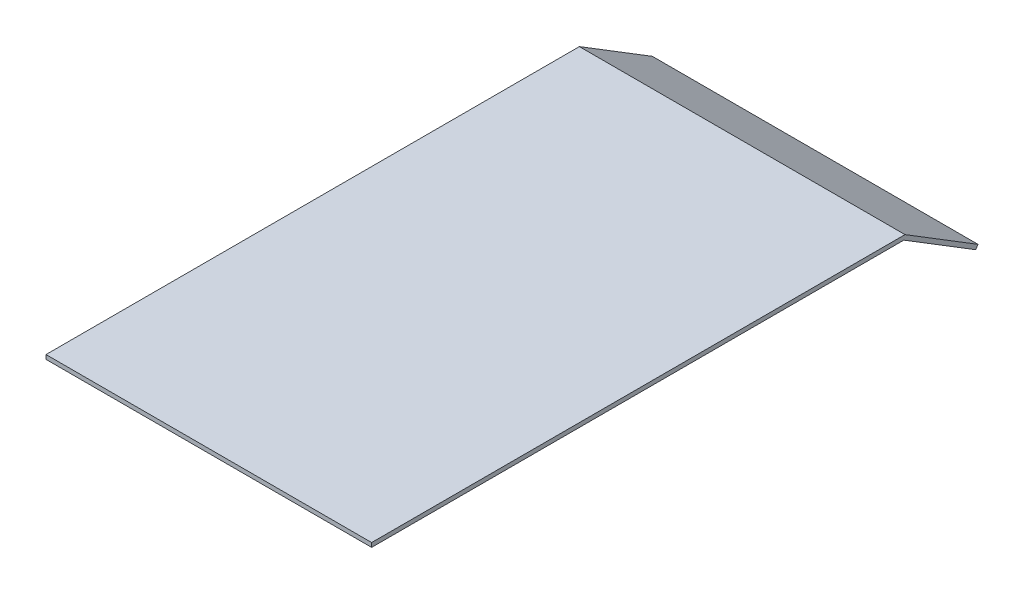
ISO-10303-21;
HEADER;
FILE_DESCRIPTION(('STEP AP214'),'2;1');
FILE_NAME('part.step','',(''),(''),'','','');
FILE_SCHEMA(('AUTOMOTIVE_DESIGN { 1 0 10303 214 1 1 1 1 }'));
ENDSEC;
DATA;
#1=APPLICATION_CONTEXT('core data for automotive mechanical design processes');
#2=APPLICATION_PROTOCOL_DEFINITION('international standard','automotive_design',2000,#1);
#3=PRODUCT_CONTEXT('',#1,'mechanical');
#4=PRODUCT('Part','Part','',(#3));
#5=PRODUCT_RELATED_PRODUCT_CATEGORY('part','',(#4));
#6=PRODUCT_DEFINITION_FORMATION('','',#4);
#7=PRODUCT_DEFINITION_CONTEXT('part definition',#1,'design');
#8=PRODUCT_DEFINITION('design','',#6,#7);
#9=PRODUCT_DEFINITION_SHAPE('','',#8);
#10=(LENGTH_UNIT() NAMED_UNIT(*) SI_UNIT(.MILLI.,.METRE.));
#11=(NAMED_UNIT(*) PLANE_ANGLE_UNIT() SI_UNIT($,.RADIAN.));
#12=(NAMED_UNIT(*) SI_UNIT($,.STERADIAN.) SOLID_ANGLE_UNIT());
#13=UNCERTAINTY_MEASURE_WITH_UNIT(LENGTH_MEASURE(1.E-05),#10,'distance_accuracy_value','');
#14=(GEOMETRIC_REPRESENTATION_CONTEXT(3) GLOBAL_UNCERTAINTY_ASSIGNED_CONTEXT((#13)) GLOBAL_UNIT_ASSIGNED_CONTEXT((#10,
#11,#12)) REPRESENTATION_CONTEXT('',''));
#15=CARTESIAN_POINT('',(0.,0.,0.));
#16=DIRECTION('',(0.,0.,1.));
#17=DIRECTION('',(1.,0.,0.));
#18=AXIS2_PLACEMENT_3D('',#15,#16,#17);
#19=CARTESIAN_POINT('',(116.,3.,-190.));
#20=DIRECTION('',(-1.,0.,0.));
#21=DIRECTION('',(0.,0.,1.));
#22=AXIS2_PLACEMENT_3D('',#19,#20,#21);
#23=PLANE('',#22);
#24=DIRECTION('',(0.,0.,-1.));
#25=VECTOR('',#24,1.);
#26=CARTESIAN_POINT('',(116.,0.,-190.));
#27=LINE('',#26,#25);
#28=CARTESIAN_POINT('',(116.,0.,190.));
#29=VERTEX_POINT('',#28);
#30=CARTESIAN_POINT('',(116.,0.,-189.150873429072));
#31=VERTEX_POINT('',#30);
#32=EDGE_CURVE('E121',#29,#31,#27,.T.);
#33=ORIENTED_EDGE('',*,*,#32,.T.);
#34=DIRECTION('',(0.,-0.524097425664335,-0.851658316704544));
#35=VECTOR('',#34,1.);
#36=CARTESIAN_POINT('',(116.,0.445025049886368,-188.427707723007));
#37=LINE('',#36,#35);
#38=CARTESIAN_POINT('',(116.,-31.5549749501136,-240.427707723007));
#39=VERTEX_POINT('',#38);
#40=EDGE_CURVE('E157',#31,#39,#37,.T.);
#41=ORIENTED_EDGE('',*,*,#40,.T.);
#42=DIRECTION('',(0.,-0.851658316704548,0.524097425664328));
#43=VECTOR('',#42,1.);
#44=CARTESIAN_POINT('',(116.,-29.,-242.));
#45=LINE('',#44,#43);
#46=CARTESIAN_POINT('',(116.,-29.,-242.));
#47=VERTEX_POINT('',#46);
#48=EDGE_CURVE('E115',#47,#39,#45,.T.);
#49=ORIENTED_EDGE('',*,*,#48,.F.);
#50=DIRECTION('',(0.,-0.524097425664335,-0.851658316704544));
#51=VECTOR('',#50,1.);
#52=CARTESIAN_POINT('',(116.,3.,-190.));
#53=LINE('',#52,#51);
#54=CARTESIAN_POINT('',(116.,3.,-190.));
#55=VERTEX_POINT('',#54);
#56=EDGE_CURVE('E102',#55,#47,#53,.T.);
#57=ORIENTED_EDGE('',*,*,#56,.F.);
#58=DIRECTION('',(0.,0.,-1.));
#59=VECTOR('',#58,1.);
#60=CARTESIAN_POINT('',(116.,3.,-190.));
#61=LINE('',#60,#59);
#62=CARTESIAN_POINT('',(116.,3.,190.));
#63=VERTEX_POINT('',#62);
#64=EDGE_CURVE('E126',#63,#55,#61,.T.);
#65=ORIENTED_EDGE('',*,*,#64,.F.);
#66=DIRECTION('',(0.,-1.,0.));
#67=VECTOR('',#66,1.);
#68=CARTESIAN_POINT('',(116.,3.,190.));
#69=LINE('',#68,#67);
#70=EDGE_CURVE('E139',#63,#29,#69,.T.);
#71=ORIENTED_EDGE('',*,*,#70,.T.);
#72=EDGE_LOOP('',(#33,#41,#49,#57,#65,#71));
#73=FACE_BOUND('',#72,.T.);
#74=ADVANCED_FACE('F39',(#73),#23,.F.);
#75=CARTESIAN_POINT('',(-116.,3.,-190.));
#76=DIRECTION('',(1.,0.,0.));
#77=DIRECTION('',(0.,0.,-1.));
#78=AXIS2_PLACEMENT_3D('',#75,#76,#77);
#79=PLANE('',#78);
#80=DIRECTION('',(0.,-0.524097425664335,-0.851658316704544));
#81=VECTOR('',#80,1.);
#82=CARTESIAN_POINT('',(-116.,0.445025049886368,-188.427707723007));
#83=LINE('',#82,#81);
#84=CARTESIAN_POINT('',(-116.,0.,-189.150873429072));
#85=VERTEX_POINT('',#84);
#86=CARTESIAN_POINT('',(-116.,-31.5549749501136,-240.427707723007));
#87=VERTEX_POINT('',#86);
#88=EDGE_CURVE('E94',#85,#87,#83,.T.);
#89=ORIENTED_EDGE('',*,*,#88,.F.);
#90=DIRECTION('',(0.,0.,1.));
#91=VECTOR('',#90,1.);
#92=CARTESIAN_POINT('',(-116.,0.,-190.));
#93=LINE('',#92,#91);
#94=CARTESIAN_POINT('',(-116.,0.,190.));
#95=VERTEX_POINT('',#94);
#96=EDGE_CURVE('E67',#85,#95,#93,.T.);
#97=ORIENTED_EDGE('',*,*,#96,.T.);
#98=DIRECTION('',(0.,-1.,0.));
#99=VECTOR('',#98,1.);
#100=CARTESIAN_POINT('',(-116.,3.,190.));
#101=LINE('',#100,#99);
#102=CARTESIAN_POINT('',(-116.,3.,190.));
#103=VERTEX_POINT('',#102);
#104=EDGE_CURVE('E48',#103,#95,#101,.T.);
#105=ORIENTED_EDGE('',*,*,#104,.F.);
#106=DIRECTION('',(0.,0.,1.));
#107=VECTOR('',#106,1.);
#108=CARTESIAN_POINT('',(-116.,3.,-190.));
#109=LINE('',#108,#107);
#110=CARTESIAN_POINT('',(-116.,3.,-190.));
#111=VERTEX_POINT('',#110);
#112=EDGE_CURVE('E134',#111,#103,#109,.T.);
#113=ORIENTED_EDGE('',*,*,#112,.F.);
#114=DIRECTION('',(0.,-0.524097425664335,-0.851658316704544));
#115=VECTOR('',#114,1.);
#116=CARTESIAN_POINT('',(-116.,3.,-190.));
#117=LINE('',#116,#115);
#118=CARTESIAN_POINT('',(-116.,-29.,-242.));
#119=VERTEX_POINT('',#118);
#120=EDGE_CURVE('E107',#111,#119,#117,.T.);
#121=ORIENTED_EDGE('',*,*,#120,.T.);
#122=DIRECTION('',(0.,-0.851658316704548,0.524097425664328));
#123=VECTOR('',#122,1.);
#124=CARTESIAN_POINT('',(-116.,-29.,-242.));
#125=LINE('',#124,#123);
#126=EDGE_CURVE('E101',#119,#87,#125,.T.);
#127=ORIENTED_EDGE('',*,*,#126,.T.);
#128=EDGE_LOOP('',(#89,#97,#105,#113,#121,#127));
#129=FACE_BOUND('',#128,.T.);
#130=ADVANCED_FACE('F105',(#129),#79,.F.);
#131=CARTESIAN_POINT('',(-116.,3.,190.));
#132=DIRECTION('',(0.,0.,-1.));
#133=DIRECTION('',(-1.,0.,0.));
#134=AXIS2_PLACEMENT_3D('',#131,#132,#133);
#135=PLANE('',#134);
#136=DIRECTION('',(1.,0.,0.));
#137=VECTOR('',#136,1.);
#138=CARTESIAN_POINT('',(-116.,0.,190.));
#139=LINE('',#138,#137);
#140=EDGE_CURVE('E130',#95,#29,#139,.T.);
#141=ORIENTED_EDGE('',*,*,#140,.T.);
#142=ORIENTED_EDGE('',*,*,#70,.F.);
#143=DIRECTION('',(1.,0.,0.));
#144=VECTOR('',#143,1.);
#145=CARTESIAN_POINT('',(-116.,3.,190.));
#146=LINE('',#145,#144);
#147=EDGE_CURVE('E56',#103,#63,#146,.T.);
#148=ORIENTED_EDGE('',*,*,#147,.F.);
#149=ORIENTED_EDGE('',*,*,#104,.T.);
#150=EDGE_LOOP('',(#141,#142,#148,#149));
#151=FACE_BOUND('',#150,.T.);
#152=ADVANCED_FACE('F152',(#151),#135,.F.);
#153=CARTESIAN_POINT('',(0.,3.,0.));
#154=DIRECTION('',(0.,1.,0.));
#155=DIRECTION('',(0.,0.,1.));
#156=AXIS2_PLACEMENT_3D('',#153,#154,#155);
#157=PLANE('',#156);
#158=ORIENTED_EDGE('',*,*,#64,.T.);
#159=DIRECTION('',(-1.,0.,0.));
#160=VECTOR('',#159,1.);
#161=CARTESIAN_POINT('',(-116.,3.,-190.));
#162=LINE('',#161,#160);
#163=EDGE_CURVE('E129',#55,#111,#162,.T.);
#164=ORIENTED_EDGE('',*,*,#163,.T.);
#165=ORIENTED_EDGE('',*,*,#112,.T.);
#166=ORIENTED_EDGE('',*,*,#147,.T.);
#167=EDGE_LOOP('',(#158,#164,#165,#166));
#168=FACE_BOUND('',#167,.T.);
#169=ADVANCED_FACE('F160',(#168),#157,.T.);
#170=CARTESIAN_POINT('',(0.,0.,0.));
#171=DIRECTION('',(0.,1.,0.));
#172=DIRECTION('',(0.,0.,1.));
#173=AXIS2_PLACEMENT_3D('',#170,#171,#172);
#174=PLANE('',#173);
#175=ORIENTED_EDGE('',*,*,#96,.F.);
#176=DIRECTION('',(1.,0.,0.));
#177=VECTOR('',#176,1.);
#178=CARTESIAN_POINT('',(0.,0.,-189.150873429072));
#179=LINE('',#178,#177);
#180=EDGE_CURVE('E11',#85,#31,#179,.T.);
#181=ORIENTED_EDGE('',*,*,#180,.T.);
#182=ORIENTED_EDGE('',*,*,#32,.F.);
#183=ORIENTED_EDGE('',*,*,#140,.F.);
#184=EDGE_LOOP('',(#175,#181,#182,#183));
#185=FACE_BOUND('',#184,.T.);
#186=ADVANCED_FACE('F155',(#185),#174,.F.);
#187=CARTESIAN_POINT('',(-116.,0.445025049886368,-188.427707723007));
#188=DIRECTION('',(0.,-0.851658316704544,0.524097425664335));
#189=DIRECTION('',(0.,-0.524097425664335,-0.851658316704544));
#190=AXIS2_PLACEMENT_3D('',#187,#188,#189);
#191=PLANE('',#190);
#192=ORIENTED_EDGE('',*,*,#180,.F.);
#193=ORIENTED_EDGE('',*,*,#88,.T.);
#194=DIRECTION('',(1.,0.,0.));
#195=VECTOR('',#194,1.);
#196=CARTESIAN_POINT('',(-116.,-31.5549749501136,-240.427707723007));
#197=LINE('',#196,#195);
#198=EDGE_CURVE('E98',#87,#39,#197,.T.);
#199=ORIENTED_EDGE('',*,*,#198,.T.);
#200=ORIENTED_EDGE('',*,*,#40,.F.);
#201=EDGE_LOOP('',(#192,#193,#199,#200));
#202=FACE_BOUND('',#201,.T.);
#203=ADVANCED_FACE('F96',(#202),#191,.T.);
#204=CARTESIAN_POINT('',(-116.,3.,-190.));
#205=DIRECTION('',(0.,-0.851658316704544,0.524097425664335));
#206=DIRECTION('',(0.,-0.524097425664335,-0.851658316704544));
#207=AXIS2_PLACEMENT_3D('',#204,#205,#206);
#208=PLANE('',#207);
#209=ORIENTED_EDGE('',*,*,#56,.T.);
#210=DIRECTION('',(1.,0.,0.));
#211=VECTOR('',#210,1.);
#212=CARTESIAN_POINT('',(-116.,-29.,-242.));
#213=LINE('',#212,#211);
#214=EDGE_CURVE('E117',#119,#47,#213,.T.);
#215=ORIENTED_EDGE('',*,*,#214,.F.);
#216=ORIENTED_EDGE('',*,*,#120,.F.);
#217=ORIENTED_EDGE('',*,*,#163,.F.);
#218=EDGE_LOOP('',(#209,#215,#216,#217));
#219=FACE_BOUND('',#218,.T.);
#220=ADVANCED_FACE('F162',(#219),#208,.F.);
#221=CARTESIAN_POINT('',(-116.,-29.,-242.));
#222=DIRECTION('',(0.,0.524097425664328,0.851658316704548));
#223=DIRECTION('',(0.,-0.851658316704548,0.524097425664328));
#224=AXIS2_PLACEMENT_3D('',#221,#222,#223);
#225=PLANE('',#224);
#226=ORIENTED_EDGE('',*,*,#48,.T.);
#227=ORIENTED_EDGE('',*,*,#198,.F.);
#228=ORIENTED_EDGE('',*,*,#126,.F.);
#229=ORIENTED_EDGE('',*,*,#214,.T.);
#230=EDGE_LOOP('',(#226,#227,#228,#229));
#231=FACE_BOUND('',#230,.T.);
#232=ADVANCED_FACE('F113',(#231),#225,.F.);
#233=CLOSED_SHELL('',(#74,#130,#152,#169,#186,#203,#220,#232));
#234=MANIFOLD_SOLID_BREP('B2',#233);
#235=ADVANCED_BREP_SHAPE_REPRESENTATION('',(#18,#234),#14);
#236=SHAPE_DEFINITION_REPRESENTATION(#9,#235);
ENDSEC;
END-ISO-10303-21;
